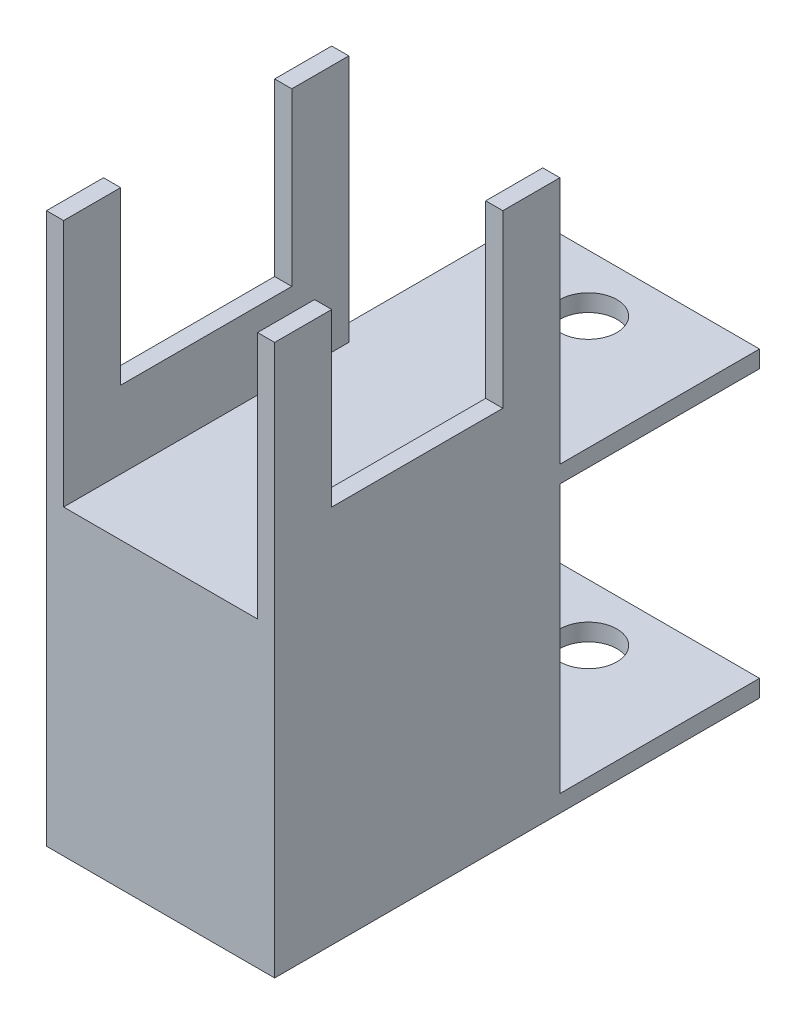
ISO-10303-21;
HEADER;
FILE_DESCRIPTION(('STEP AP214'),'2;1');
FILE_NAME('part.step','',(''),(''),'','','');
FILE_SCHEMA(('AUTOMOTIVE_DESIGN { 1 0 10303 214 1 1 1 1 }'));
ENDSEC;
DATA;
#1=APPLICATION_CONTEXT('core data for automotive mechanical design processes');
#2=APPLICATION_PROTOCOL_DEFINITION('international standard','automotive_design',2000,#1);
#3=PRODUCT_CONTEXT('',#1,'mechanical');
#4=PRODUCT('Part','Part','',(#3));
#5=PRODUCT_RELATED_PRODUCT_CATEGORY('part','',(#4));
#6=PRODUCT_DEFINITION_FORMATION('','',#4);
#7=PRODUCT_DEFINITION_CONTEXT('part definition',#1,'design');
#8=PRODUCT_DEFINITION('design','',#6,#7);
#9=PRODUCT_DEFINITION_SHAPE('','',#8);
#10=(LENGTH_UNIT() NAMED_UNIT(*) SI_UNIT(.MILLI.,.METRE.));
#11=(NAMED_UNIT(*) PLANE_ANGLE_UNIT() SI_UNIT($,.RADIAN.));
#12=(NAMED_UNIT(*) SI_UNIT($,.STERADIAN.) SOLID_ANGLE_UNIT());
#13=UNCERTAINTY_MEASURE_WITH_UNIT(LENGTH_MEASURE(1.E-05),#10,'distance_accuracy_value','');
#14=(GEOMETRIC_REPRESENTATION_CONTEXT(3) GLOBAL_UNCERTAINTY_ASSIGNED_CONTEXT((#13)) GLOBAL_UNIT_ASSIGNED_CONTEXT((#10,
#11,#12)) REPRESENTATION_CONTEXT('',''));
#15=CARTESIAN_POINT('',(0.,0.,0.));
#16=DIRECTION('',(0.,0.,1.));
#17=DIRECTION('',(1.,0.,0.));
#18=AXIS2_PLACEMENT_3D('',#15,#16,#17);
#19=CARTESIAN_POINT('',(20.,70.,25.));
#20=DIRECTION('',(0.,0.,1.));
#21=DIRECTION('',(1.,0.,0.));
#22=AXIS2_PLACEMENT_3D('',#19,#20,#21);
#23=PLANE('',#22);
#24=DIRECTION('',(0.,-1.,0.));
#25=VECTOR('',#24,1.);
#26=CARTESIAN_POINT('',(17.,70.,25.));
#27=LINE('',#26,#25);
#28=CARTESIAN_POINT('',(17.,70.,25.));
#29=VERTEX_POINT('',#28);
#30=CARTESIAN_POINT('',(17.,26.5,25.));
#31=VERTEX_POINT('',#30);
#32=EDGE_CURVE('E182',#29,#31,#27,.T.);
#33=ORIENTED_EDGE('',*,*,#32,.F.);
#34=DIRECTION('',(-1.,0.,0.));
#35=VECTOR('',#34,1.);
#36=CARTESIAN_POINT('',(20.,70.,25.));
#37=LINE('',#36,#35);
#38=CARTESIAN_POINT('',(20.,70.,25.));
#39=VERTEX_POINT('',#38);
#40=EDGE_CURVE('E238',#39,#29,#37,.T.);
#41=ORIENTED_EDGE('',*,*,#40,.F.);
#42=DIRECTION('',(0.,1.,0.));
#43=VECTOR('',#42,1.);
#44=CARTESIAN_POINT('',(20.,70.,25.));
#45=LINE('',#44,#43);
#46=CARTESIAN_POINT('',(20.,26.5,25.));
#47=VERTEX_POINT('',#46);
#48=EDGE_CURVE('E268',#47,#39,#45,.T.);
#49=ORIENTED_EDGE('',*,*,#48,.F.);
#50=DIRECTION('',(-1.,0.,0.));
#51=VECTOR('',#50,1.);
#52=CARTESIAN_POINT('',(20.,26.5,25.));
#53=LINE('',#52,#51);
#54=EDGE_CURVE('E242',#47,#31,#53,.T.);
#55=ORIENTED_EDGE('',*,*,#54,.T.);
#56=EDGE_LOOP('',(#33,#41,#49,#55));
#57=FACE_BOUND('',#56,.T.);
#58=ADVANCED_FACE('F33',(#57),#23,.F.);
#59=DIRECTION('',(0.,1.,0.));
#60=VECTOR('',#59,1.);
#61=CARTESIAN_POINT('',(-17.,70.,25.));
#62=LINE('',#61,#60);
#63=CARTESIAN_POINT('',(-17.,26.5,25.));
#64=VERTEX_POINT('',#63);
#65=CARTESIAN_POINT('',(-17.,70.,25.));
#66=VERTEX_POINT('',#65);
#67=EDGE_CURVE('E315',#64,#66,#62,.T.);
#68=ORIENTED_EDGE('',*,*,#67,.F.);
#69=CARTESIAN_POINT('',(-20.,26.5,25.));
#70=VERTEX_POINT('',#69);
#71=EDGE_CURVE('E241',#64,#70,#53,.T.);
#72=ORIENTED_EDGE('',*,*,#71,.T.);
#73=DIRECTION('',(0.,1.,0.));
#74=VECTOR('',#73,1.);
#75=CARTESIAN_POINT('',(-20.,70.,25.));
#76=LINE('',#75,#74);
#77=CARTESIAN_POINT('',(-20.,70.,25.));
#78=VERTEX_POINT('',#77);
#79=EDGE_CURVE('E189',#70,#78,#76,.T.);
#80=ORIENTED_EDGE('',*,*,#79,.T.);
#81=EDGE_CURVE('E237',#66,#78,#37,.T.);
#82=ORIENTED_EDGE('',*,*,#81,.F.);
#83=EDGE_LOOP('',(#68,#72,#80,#82));
#84=FACE_BOUND('',#83,.T.);
#85=ADVANCED_FACE('F372',(#84),#23,.F.);
#86=CARTESIAN_POINT('',(20.,70.,35.));
#87=DIRECTION('',(0.,-1.,0.));
#88=DIRECTION('',(0.,0.,-1.));
#89=AXIS2_PLACEMENT_3D('',#86,#87,#88);
#90=PLANE('',#89);
#91=DIRECTION('',(0.,0.,-1.));
#92=VECTOR('',#91,1.);
#93=CARTESIAN_POINT('',(17.,70.,75.));
#94=LINE('',#93,#92);
#95=CARTESIAN_POINT('',(17.,70.,35.));
#96=VERTEX_POINT('',#95);
#97=EDGE_CURVE('E328',#96,#29,#94,.T.);
#98=ORIENTED_EDGE('',*,*,#97,.F.);
#99=DIRECTION('',(-1.,0.,0.));
#100=VECTOR('',#99,1.);
#101=CARTESIAN_POINT('',(20.,70.,35.));
#102=LINE('',#101,#100);
#103=CARTESIAN_POINT('',(20.,70.,35.));
#104=VERTEX_POINT('',#103);
#105=EDGE_CURVE('E234',#104,#96,#102,.T.);
#106=ORIENTED_EDGE('',*,*,#105,.F.);
#107=DIRECTION('',(0.,0.,1.));
#108=VECTOR('',#107,1.);
#109=CARTESIAN_POINT('',(20.,70.,35.));
#110=LINE('',#109,#108);
#111=EDGE_CURVE('E270',#39,#104,#110,.T.);
#112=ORIENTED_EDGE('',*,*,#111,.F.);
#113=ORIENTED_EDGE('',*,*,#40,.T.);
#114=EDGE_LOOP('',(#98,#106,#112,#113));
#115=FACE_BOUND('',#114,.T.);
#116=ADVANCED_FACE('F378',(#115),#90,.F.);
#117=DIRECTION('',(0.,0.,-1.));
#118=VECTOR('',#117,1.);
#119=CARTESIAN_POINT('',(-17.,70.,75.));
#120=LINE('',#119,#118);
#121=CARTESIAN_POINT('',(-17.,70.,35.));
#122=VERTEX_POINT('',#121);
#123=EDGE_CURVE('E332',#122,#66,#120,.T.);
#124=ORIENTED_EDGE('',*,*,#123,.T.);
#125=ORIENTED_EDGE('',*,*,#81,.T.);
#126=DIRECTION('',(0.,0.,1.));
#127=VECTOR('',#126,1.);
#128=CARTESIAN_POINT('',(-20.,70.,35.));
#129=LINE('',#128,#127);
#130=CARTESIAN_POINT('',(-20.,70.,35.));
#131=VERTEX_POINT('',#130);
#132=EDGE_CURVE('E192',#78,#131,#129,.T.);
#133=ORIENTED_EDGE('',*,*,#132,.T.);
#134=EDGE_CURVE('E233',#122,#131,#102,.T.);
#135=ORIENTED_EDGE('',*,*,#134,.F.);
#136=EDGE_LOOP('',(#124,#125,#133,#135));
#137=FACE_BOUND('',#136,.T.);
#138=ADVANCED_FACE('F422',(#137),#90,.F.);
#139=CARTESIAN_POINT('',(20.,40.,35.));
#140=DIRECTION('',(0.,0.,-1.));
#141=DIRECTION('',(-1.,0.,0.));
#142=AXIS2_PLACEMENT_3D('',#139,#140,#141);
#143=PLANE('',#142);
#144=DIRECTION('',(0.,1.,0.));
#145=VECTOR('',#144,1.);
#146=CARTESIAN_POINT('',(17.,40.,35.));
#147=LINE('',#146,#145);
#148=CARTESIAN_POINT('',(17.,40.,35.));
#149=VERTEX_POINT('',#148);
#150=EDGE_CURVE('E306',#149,#96,#147,.T.);
#151=ORIENTED_EDGE('',*,*,#150,.F.);
#152=DIRECTION('',(-1.,0.,0.));
#153=VECTOR('',#152,1.);
#154=CARTESIAN_POINT('',(20.,40.,35.));
#155=LINE('',#154,#153);
#156=CARTESIAN_POINT('',(20.,40.,35.));
#157=VERTEX_POINT('',#156);
#158=EDGE_CURVE('E230',#157,#149,#155,.T.);
#159=ORIENTED_EDGE('',*,*,#158,.F.);
#160=DIRECTION('',(0.,-1.,0.));
#161=VECTOR('',#160,1.);
#162=CARTESIAN_POINT('',(20.,40.,35.));
#163=LINE('',#162,#161);
#164=EDGE_CURVE('E276',#104,#157,#163,.T.);
#165=ORIENTED_EDGE('',*,*,#164,.F.);
#166=ORIENTED_EDGE('',*,*,#105,.T.);
#167=EDGE_LOOP('',(#151,#159,#165,#166));
#168=FACE_BOUND('',#167,.T.);
#169=ADVANCED_FACE('F420',(#168),#143,.F.);
#170=DIRECTION('',(0.,-1.,0.));
#171=VECTOR('',#170,1.);
#172=CARTESIAN_POINT('',(-17.,40.,35.));
#173=LINE('',#172,#171);
#174=CARTESIAN_POINT('',(-17.,40.,35.));
#175=VERTEX_POINT('',#174);
#176=EDGE_CURVE('E318',#122,#175,#173,.T.);
#177=ORIENTED_EDGE('',*,*,#176,.F.);
#178=ORIENTED_EDGE('',*,*,#134,.T.);
#179=DIRECTION('',(0.,-1.,0.));
#180=VECTOR('',#179,1.);
#181=CARTESIAN_POINT('',(-20.,40.,35.));
#182=LINE('',#181,#180);
#183=CARTESIAN_POINT('',(-20.,40.,35.));
#184=VERTEX_POINT('',#183);
#185=EDGE_CURVE('E195',#131,#184,#182,.T.);
#186=ORIENTED_EDGE('',*,*,#185,.T.);
#187=EDGE_CURVE('E229',#175,#184,#155,.T.);
#188=ORIENTED_EDGE('',*,*,#187,.F.);
#189=EDGE_LOOP('',(#177,#178,#186,#188));
#190=FACE_BOUND('',#189,.T.);
#191=ADVANCED_FACE('F418',(#190),#143,.F.);
#192=CARTESIAN_POINT('',(20.,40.,65.));
#193=DIRECTION('',(0.,-1.,0.));
#194=DIRECTION('',(0.,0.,-1.));
#195=AXIS2_PLACEMENT_3D('',#192,#193,#194);
#196=PLANE('',#195);
#197=DIRECTION('',(0.,0.,-1.));
#198=VECTOR('',#197,1.);
#199=CARTESIAN_POINT('',(17.,40.,65.));
#200=LINE('',#199,#198);
#201=CARTESIAN_POINT('',(17.,40.,65.));
#202=VERTEX_POINT('',#201);
#203=EDGE_CURVE('E309',#202,#149,#200,.T.);
#204=ORIENTED_EDGE('',*,*,#203,.F.);
#205=DIRECTION('',(-1.,0.,0.));
#206=VECTOR('',#205,1.);
#207=CARTESIAN_POINT('',(20.,40.,65.));
#208=LINE('',#207,#206);
#209=CARTESIAN_POINT('',(20.,40.,65.));
#210=VERTEX_POINT('',#209);
#211=EDGE_CURVE('E226',#210,#202,#208,.T.);
#212=ORIENTED_EDGE('',*,*,#211,.F.);
#213=DIRECTION('',(0.,0.,1.));
#214=VECTOR('',#213,1.);
#215=CARTESIAN_POINT('',(20.,40.,65.));
#216=LINE('',#215,#214);
#217=EDGE_CURVE('E278',#157,#210,#216,.T.);
#218=ORIENTED_EDGE('',*,*,#217,.F.);
#219=ORIENTED_EDGE('',*,*,#158,.T.);
#220=EDGE_LOOP('',(#204,#212,#218,#219));
#221=FACE_BOUND('',#220,.T.);
#222=ADVANCED_FACE('F416',(#221),#196,.F.);
#223=DIRECTION('',(0.,0.,1.));
#224=VECTOR('',#223,1.);
#225=CARTESIAN_POINT('',(-17.,40.,65.));
#226=LINE('',#225,#224);
#227=CARTESIAN_POINT('',(-17.,40.,65.));
#228=VERTEX_POINT('',#227);
#229=EDGE_CURVE('E321',#175,#228,#226,.T.);
#230=ORIENTED_EDGE('',*,*,#229,.F.);
#231=ORIENTED_EDGE('',*,*,#187,.T.);
#232=DIRECTION('',(0.,0.,1.));
#233=VECTOR('',#232,1.);
#234=CARTESIAN_POINT('',(-20.,40.,65.));
#235=LINE('',#234,#233);
#236=CARTESIAN_POINT('',(-20.,40.,65.));
#237=VERTEX_POINT('',#236);
#238=EDGE_CURVE('E198',#184,#237,#235,.T.);
#239=ORIENTED_EDGE('',*,*,#238,.T.);
#240=EDGE_CURVE('E225',#228,#237,#208,.T.);
#241=ORIENTED_EDGE('',*,*,#240,.F.);
#242=EDGE_LOOP('',(#230,#231,#239,#241));
#243=FACE_BOUND('',#242,.T.);
#244=ADVANCED_FACE('F414',(#243),#196,.F.);
#245=CARTESIAN_POINT('',(20.,70.,65.));
#246=DIRECTION('',(0.,0.,1.));
#247=DIRECTION('',(1.,0.,0.));
#248=AXIS2_PLACEMENT_3D('',#245,#246,#247);
#249=PLANE('',#248);
#250=DIRECTION('',(0.,-1.,0.));
#251=VECTOR('',#250,1.);
#252=CARTESIAN_POINT('',(17.,70.,65.));
#253=LINE('',#252,#251);
#254=CARTESIAN_POINT('',(17.,70.,65.));
#255=VERTEX_POINT('',#254);
#256=EDGE_CURVE('E312',#255,#202,#253,.T.);
#257=ORIENTED_EDGE('',*,*,#256,.F.);
#258=DIRECTION('',(-1.,0.,0.));
#259=VECTOR('',#258,1.);
#260=CARTESIAN_POINT('',(20.,70.,65.));
#261=LINE('',#260,#259);
#262=CARTESIAN_POINT('',(20.,70.,65.));
#263=VERTEX_POINT('',#262);
#264=EDGE_CURVE('E222',#263,#255,#261,.T.);
#265=ORIENTED_EDGE('',*,*,#264,.F.);
#266=DIRECTION('',(0.,1.,0.));
#267=VECTOR('',#266,1.);
#268=CARTESIAN_POINT('',(20.,70.,65.));
#269=LINE('',#268,#267);
#270=EDGE_CURVE('E280',#210,#263,#269,.T.);
#271=ORIENTED_EDGE('',*,*,#270,.F.);
#272=ORIENTED_EDGE('',*,*,#211,.T.);
#273=EDGE_LOOP('',(#257,#265,#271,#272));
#274=FACE_BOUND('',#273,.T.);
#275=ADVANCED_FACE('F411',(#274),#249,.F.);
#276=DIRECTION('',(0.,1.,0.));
#277=VECTOR('',#276,1.);
#278=CARTESIAN_POINT('',(-17.,70.,65.));
#279=LINE('',#278,#277);
#280=CARTESIAN_POINT('',(-17.,70.,65.));
#281=VERTEX_POINT('',#280);
#282=EDGE_CURVE('E324',#228,#281,#279,.T.);
#283=ORIENTED_EDGE('',*,*,#282,.F.);
#284=ORIENTED_EDGE('',*,*,#240,.T.);
#285=DIRECTION('',(0.,1.,0.));
#286=VECTOR('',#285,1.);
#287=CARTESIAN_POINT('',(-20.,70.,65.));
#288=LINE('',#287,#286);
#289=CARTESIAN_POINT('',(-20.,70.,65.));
#290=VERTEX_POINT('',#289);
#291=EDGE_CURVE('E201',#237,#290,#288,.T.);
#292=ORIENTED_EDGE('',*,*,#291,.T.);
#293=EDGE_CURVE('E221',#281,#290,#261,.T.);
#294=ORIENTED_EDGE('',*,*,#293,.F.);
#295=EDGE_LOOP('',(#283,#284,#292,#294));
#296=FACE_BOUND('',#295,.T.);
#297=ADVANCED_FACE('F410',(#296),#249,.F.);
#298=CARTESIAN_POINT('',(20.,70.,75.));
#299=DIRECTION('',(0.,-1.,0.));
#300=DIRECTION('',(0.,0.,-1.));
#301=AXIS2_PLACEMENT_3D('',#298,#299,#300);
#302=PLANE('',#301);
#303=CARTESIAN_POINT('',(17.,70.,75.));
#304=VERTEX_POINT('',#303);
#305=EDGE_CURVE('E292',#304,#255,#94,.T.);
#306=ORIENTED_EDGE('',*,*,#305,.F.);
#307=DIRECTION('',(-1.,0.,0.));
#308=VECTOR('',#307,1.);
#309=CARTESIAN_POINT('',(20.,70.,75.));
#310=LINE('',#309,#308);
#311=CARTESIAN_POINT('',(20.,70.,75.));
#312=VERTEX_POINT('',#311);
#313=EDGE_CURVE('E218',#312,#304,#310,.T.);
#314=ORIENTED_EDGE('',*,*,#313,.F.);
#315=DIRECTION('',(0.,0.,1.));
#316=VECTOR('',#315,1.);
#317=CARTESIAN_POINT('',(20.,70.,75.));
#318=LINE('',#317,#316);
#319=EDGE_CURVE('E282',#263,#312,#318,.T.);
#320=ORIENTED_EDGE('',*,*,#319,.F.);
#321=ORIENTED_EDGE('',*,*,#264,.T.);
#322=EDGE_LOOP('',(#306,#314,#320,#321));
#323=FACE_BOUND('',#322,.T.);
#324=ADVANCED_FACE('F289',(#323),#302,.F.);
#325=CARTESIAN_POINT('',(-17.,70.,75.));
#326=VERTEX_POINT('',#325);
#327=EDGE_CURVE('E329',#326,#281,#120,.T.);
#328=ORIENTED_EDGE('',*,*,#327,.T.);
#329=ORIENTED_EDGE('',*,*,#293,.T.);
#330=DIRECTION('',(0.,0.,1.));
#331=VECTOR('',#330,1.);
#332=CARTESIAN_POINT('',(-20.,70.,75.));
#333=LINE('',#332,#331);
#334=CARTESIAN_POINT('',(-20.,70.,75.));
#335=VERTEX_POINT('',#334);
#336=EDGE_CURVE('E204',#290,#335,#333,.T.);
#337=ORIENTED_EDGE('',*,*,#336,.T.);
#338=EDGE_CURVE('E217',#326,#335,#310,.T.);
#339=ORIENTED_EDGE('',*,*,#338,.F.);
#340=EDGE_LOOP('',(#328,#329,#337,#339));
#341=FACE_BOUND('',#340,.T.);
#342=ADVANCED_FACE('F399',(#341),#302,.F.);
#343=CARTESIAN_POINT('',(20.,-26.5,75.));
#344=DIRECTION('',(0.,0.,-1.));
#345=DIRECTION('',(-1.,0.,0.));
#346=AXIS2_PLACEMENT_3D('',#343,#344,#345);
#347=PLANE('',#346);
#348=DIRECTION('',(0.,1.,0.));
#349=VECTOR('',#348,1.);
#350=CARTESIAN_POINT('',(17.,70.,75.));
#351=LINE('',#350,#349);
#352=CARTESIAN_POINT('',(17.,26.5,75.));
#353=VERTEX_POINT('',#352);
#354=EDGE_CURVE('E340',#353,#304,#351,.T.);
#355=ORIENTED_EDGE('',*,*,#354,.F.);
#356=DIRECTION('',(1.,0.,0.));
#357=VECTOR('',#356,1.);
#358=CARTESIAN_POINT('',(17.,26.5,75.));
#359=LINE('',#358,#357);
#360=CARTESIAN_POINT('',(-17.,26.5,75.));
#361=VERTEX_POINT('',#360);
#362=EDGE_CURVE('E336',#361,#353,#359,.T.);
#363=ORIENTED_EDGE('',*,*,#362,.F.);
#364=DIRECTION('',(0.,-1.,0.));
#365=VECTOR('',#364,1.);
#366=CARTESIAN_POINT('',(-17.,70.,75.));
#367=LINE('',#366,#365);
#368=EDGE_CURVE('E338',#326,#361,#367,.T.);
#369=ORIENTED_EDGE('',*,*,#368,.F.);
#370=ORIENTED_EDGE('',*,*,#338,.T.);
#371=DIRECTION('',(0.,-1.,0.));
#372=VECTOR('',#371,1.);
#373=CARTESIAN_POINT('',(-20.,-26.5,75.));
#374=LINE('',#373,#372);
#375=CARTESIAN_POINT('',(-20.,-26.5,75.));
#376=VERTEX_POINT('',#375);
#377=EDGE_CURVE('E207',#335,#376,#374,.T.);
#378=ORIENTED_EDGE('',*,*,#377,.T.);
#379=DIRECTION('',(-1.,0.,0.));
#380=VECTOR('',#379,1.);
#381=CARTESIAN_POINT('',(20.,-26.5,75.));
#382=LINE('',#381,#380);
#383=CARTESIAN_POINT('',(20.,-26.5,75.));
#384=VERTEX_POINT('',#383);
#385=EDGE_CURVE('E169',#384,#376,#382,.T.);
#386=ORIENTED_EDGE('',*,*,#385,.F.);
#387=DIRECTION('',(0.,-1.,0.));
#388=VECTOR('',#387,1.);
#389=CARTESIAN_POINT('',(20.,-26.5,75.));
#390=LINE('',#389,#388);
#391=EDGE_CURVE('E157',#312,#384,#390,.T.);
#392=ORIENTED_EDGE('',*,*,#391,.F.);
#393=ORIENTED_EDGE('',*,*,#313,.T.);
#394=EDGE_LOOP('',(#355,#363,#369,#370,#378,#386,#392,#393));
#395=FACE_BOUND('',#394,.T.);
#396=ADVANCED_FACE('F295',(#395),#347,.F.);
#397=CARTESIAN_POINT('',(20.,23.5,25.));
#398=DIRECTION('',(0.,0.,1.));
#399=DIRECTION('',(1.,0.,0.));
#400=AXIS2_PLACEMENT_3D('',#397,#398,#399);
#401=PLANE('',#400);
#402=DIRECTION('',(0.,1.,0.));
#403=VECTOR('',#402,1.);
#404=CARTESIAN_POINT('',(-20.,23.5,25.));
#405=LINE('',#404,#403);
#406=CARTESIAN_POINT('',(-20.,-23.5,25.));
#407=VERTEX_POINT('',#406);
#408=CARTESIAN_POINT('',(-20.,23.5,25.));
#409=VERTEX_POINT('',#408);
#410=EDGE_CURVE('E178',#407,#409,#405,.T.);
#411=ORIENTED_EDGE('',*,*,#410,.T.);
#412=DIRECTION('',(-1.,0.,0.));
#413=VECTOR('',#412,1.);
#414=CARTESIAN_POINT('',(20.,23.5,25.));
#415=LINE('',#414,#413);
#416=CARTESIAN_POINT('',(20.,23.5,25.));
#417=VERTEX_POINT('',#416);
#418=EDGE_CURVE('E11',#417,#409,#415,.T.);
#419=ORIENTED_EDGE('',*,*,#418,.F.);
#420=DIRECTION('',(0.,1.,0.));
#421=VECTOR('',#420,1.);
#422=CARTESIAN_POINT('',(20.,23.5,25.));
#423=LINE('',#422,#421);
#424=CARTESIAN_POINT('',(20.,-23.5,25.));
#425=VERTEX_POINT('',#424);
#426=EDGE_CURVE('E213',#425,#417,#423,.T.);
#427=ORIENTED_EDGE('',*,*,#426,.F.);
#428=DIRECTION('',(-1.,0.,0.));
#429=VECTOR('',#428,1.);
#430=CARTESIAN_POINT('',(20.,-23.5,25.));
#431=LINE('',#430,#429);
#432=EDGE_CURVE('E174',#425,#407,#431,.T.);
#433=ORIENTED_EDGE('',*,*,#432,.T.);
#434=EDGE_LOOP('',(#411,#419,#427,#433));
#435=FACE_BOUND('',#434,.T.);
#436=ADVANCED_FACE('F35',(#435),#401,.F.);
#437=CARTESIAN_POINT('',(20.,23.5,25.));
#438=DIRECTION('',(0.,1.,0.));
#439=DIRECTION('',(0.,0.,1.));
#440=AXIS2_PLACEMENT_3D('',#437,#438,#439);
#441=PLANE('',#440);
#442=CARTESIAN_POINT('',(0.,23.5,0.));
#443=DIRECTION('',(0.,1.,0.));
#444=DIRECTION('',(0.,0.,1.));
#445=AXIS2_PLACEMENT_3D('',#442,#443,#444);
#446=CIRCLE('',#445,5.);
#447=CARTESIAN_POINT('',(0.,23.5,5.));
#448=VERTEX_POINT('',#447);
#449=EDGE_CURVE('E343',#448,#448,#446,.T.);
#450=ORIENTED_EDGE('',*,*,#449,.T.);
#451=EDGE_LOOP('',(#450));
#452=FACE_BOUND('',#451,.T.);
#453=DIRECTION('',(0.,0.,-1.));
#454=VECTOR('',#453,1.);
#455=CARTESIAN_POINT('',(-20.,23.5,25.));
#456=LINE('',#455,#454);
#457=CARTESIAN_POINT('',(-20.,23.5,-10.));
#458=VERTEX_POINT('',#457);
#459=EDGE_CURVE('E181',#409,#458,#456,.T.);
#460=ORIENTED_EDGE('',*,*,#459,.T.);
#461=DIRECTION('',(-1.,0.,0.));
#462=VECTOR('',#461,1.);
#463=CARTESIAN_POINT('',(20.,23.5,-10.));
#464=LINE('',#463,#462);
#465=CARTESIAN_POINT('',(20.,23.5,-10.));
#466=VERTEX_POINT('',#465);
#467=EDGE_CURVE('E42',#466,#458,#464,.T.);
#468=ORIENTED_EDGE('',*,*,#467,.F.);
#469=DIRECTION('',(0.,0.,-1.));
#470=VECTOR('',#469,1.);
#471=CARTESIAN_POINT('',(20.,23.5,25.));
#472=LINE('',#471,#470);
#473=EDGE_CURVE('E117',#417,#466,#472,.T.);
#474=ORIENTED_EDGE('',*,*,#473,.F.);
#475=ORIENTED_EDGE('',*,*,#418,.T.);
#476=EDGE_LOOP('',(#460,#468,#474,#475));
#477=FACE_BOUND('',#476,.T.);
#478=ADVANCED_FACE('F388',(#452,#477),#441,.F.);
#479=CARTESIAN_POINT('',(20.,23.5,-10.));
#480=DIRECTION('',(0.,0.,1.));
#481=DIRECTION('',(1.,0.,0.));
#482=AXIS2_PLACEMENT_3D('',#479,#480,#481);
#483=PLANE('',#482);
#484=DIRECTION('',(0.,1.,0.));
#485=VECTOR('',#484,1.);
#486=CARTESIAN_POINT('',(-20.,23.5,-10.));
#487=LINE('',#486,#485);
#488=CARTESIAN_POINT('',(-20.,26.5,-10.));
#489=VERTEX_POINT('',#488);
#490=EDGE_CURVE('E184',#458,#489,#487,.T.);
#491=ORIENTED_EDGE('',*,*,#490,.T.);
#492=DIRECTION('',(-1.,0.,0.));
#493=VECTOR('',#492,1.);
#494=CARTESIAN_POINT('',(20.,26.5,-10.));
#495=LINE('',#494,#493);
#496=CARTESIAN_POINT('',(20.,26.5,-10.));
#497=VERTEX_POINT('',#496);
#498=EDGE_CURVE('E245',#497,#489,#495,.T.);
#499=ORIENTED_EDGE('',*,*,#498,.F.);
#500=DIRECTION('',(0.,1.,0.));
#501=VECTOR('',#500,1.);
#502=CARTESIAN_POINT('',(20.,23.5,-10.));
#503=LINE('',#502,#501);
#504=EDGE_CURVE('E254',#466,#497,#503,.T.);
#505=ORIENTED_EDGE('',*,*,#504,.F.);
#506=ORIENTED_EDGE('',*,*,#467,.T.);
#507=EDGE_LOOP('',(#491,#499,#505,#506));
#508=FACE_BOUND('',#507,.T.);
#509=ADVANCED_FACE('F252',(#508),#483,.F.);
#510=CARTESIAN_POINT('',(20.,26.5,-10.));
#511=DIRECTION('',(0.,-1.,0.));
#512=DIRECTION('',(0.,0.,-1.));
#513=AXIS2_PLACEMENT_3D('',#510,#511,#512);
#514=PLANE('',#513);
#515=CARTESIAN_POINT('',(0.,26.5,0.));
#516=DIRECTION('',(0.,-1.,0.));
#517=DIRECTION('',(0.,0.,-1.));
#518=AXIS2_PLACEMENT_3D('',#515,#516,#517);
#519=CIRCLE('',#518,5.);
#520=CARTESIAN_POINT('',(0.,26.5,-5.));
#521=VERTEX_POINT('',#520);
#522=EDGE_CURVE('E346',#521,#521,#519,.T.);
#523=ORIENTED_EDGE('',*,*,#522,.T.);
#524=EDGE_LOOP('',(#523));
#525=FACE_BOUND('',#524,.T.);
#526=ORIENTED_EDGE('',*,*,#71,.F.);
#527=DIRECTION('',(0.,0.,-1.));
#528=VECTOR('',#527,1.);
#529=CARTESIAN_POINT('',(-17.,26.5,75.));
#530=LINE('',#529,#528);
#531=EDGE_CURVE('E49',#361,#64,#530,.T.);
#532=ORIENTED_EDGE('',*,*,#531,.F.);
#533=ORIENTED_EDGE('',*,*,#362,.T.);
#534=DIRECTION('',(0.,0.,-1.));
#535=VECTOR('',#534,1.);
#536=CARTESIAN_POINT('',(17.,26.5,75.));
#537=LINE('',#536,#535);
#538=EDGE_CURVE('E334',#353,#31,#537,.T.);
#539=ORIENTED_EDGE('',*,*,#538,.T.);
#540=ORIENTED_EDGE('',*,*,#54,.F.);
#541=DIRECTION('',(0.,0.,1.));
#542=VECTOR('',#541,1.);
#543=CARTESIAN_POINT('',(20.,26.5,-10.));
#544=LINE('',#543,#542);
#545=EDGE_CURVE('E265',#497,#47,#544,.T.);
#546=ORIENTED_EDGE('',*,*,#545,.F.);
#547=ORIENTED_EDGE('',*,*,#498,.T.);
#548=DIRECTION('',(0.,0.,1.));
#549=VECTOR('',#548,1.);
#550=CARTESIAN_POINT('',(-20.,26.5,-10.));
#551=LINE('',#550,#549);
#552=EDGE_CURVE('E186',#489,#70,#551,.T.);
#553=ORIENTED_EDGE('',*,*,#552,.T.);
#554=EDGE_LOOP('',(#526,#532,#533,#539,#540,#546,#547,#553));
#555=FACE_BOUND('',#554,.T.);
#556=ADVANCED_FACE('F261',(#525,#555),#514,.F.);
#557=CARTESIAN_POINT('',(20.,-26.5,-10.));
#558=DIRECTION('',(0.,1.,0.));
#559=DIRECTION('',(0.,0.,1.));
#560=AXIS2_PLACEMENT_3D('',#557,#558,#559);
#561=PLANE('',#560);
#562=CARTESIAN_POINT('',(0.,-26.5,0.));
#563=DIRECTION('',(0.,1.,0.));
#564=DIRECTION('',(0.,0.,1.));
#565=AXIS2_PLACEMENT_3D('',#562,#563,#564);
#566=CIRCLE('',#565,5.);
#567=CARTESIAN_POINT('',(0.,-26.5,5.));
#568=VERTEX_POINT('',#567);
#569=EDGE_CURVE('E349',#568,#568,#566,.T.);
#570=ORIENTED_EDGE('',*,*,#569,.T.);
#571=EDGE_LOOP('',(#570));
#572=FACE_BOUND('',#571,.T.);
#573=DIRECTION('',(0.,0.,-1.));
#574=VECTOR('',#573,1.);
#575=CARTESIAN_POINT('',(-20.,-26.5,-10.));
#576=LINE('',#575,#574);
#577=CARTESIAN_POINT('',(-20.,-26.5,-10.));
#578=VERTEX_POINT('',#577);
#579=EDGE_CURVE('E166',#376,#578,#576,.T.);
#580=ORIENTED_EDGE('',*,*,#579,.T.);
#581=DIRECTION('',(-1.,0.,0.));
#582=VECTOR('',#581,1.);
#583=CARTESIAN_POINT('',(20.,-26.5,-10.));
#584=LINE('',#583,#582);
#585=CARTESIAN_POINT('',(20.,-26.5,-10.));
#586=VERTEX_POINT('',#585);
#587=EDGE_CURVE('E163',#586,#578,#584,.T.);
#588=ORIENTED_EDGE('',*,*,#587,.F.);
#589=DIRECTION('',(0.,0.,-1.));
#590=VECTOR('',#589,1.);
#591=CARTESIAN_POINT('',(20.,-26.5,-10.));
#592=LINE('',#591,#590);
#593=EDGE_CURVE('E150',#384,#586,#592,.T.);
#594=ORIENTED_EDGE('',*,*,#593,.F.);
#595=ORIENTED_EDGE('',*,*,#385,.T.);
#596=EDGE_LOOP('',(#580,#588,#594,#595));
#597=FACE_BOUND('',#596,.T.);
#598=ADVANCED_FACE('F164',(#572,#597),#561,.F.);
#599=CARTESIAN_POINT('',(20.,-23.5,-10.));
#600=DIRECTION('',(0.,0.,1.));
#601=DIRECTION('',(0.,-1.,0.));
#602=AXIS2_PLACEMENT_3D('',#599,#600,#601);
#603=PLANE('',#602);
#604=DIRECTION('',(0.,1.,0.));
#605=VECTOR('',#604,1.);
#606=CARTESIAN_POINT('',(-20.,-23.5,-10.));
#607=LINE('',#606,#605);
#608=CARTESIAN_POINT('',(-20.,-23.5,-10.));
#609=VERTEX_POINT('',#608);
#610=EDGE_CURVE('E210',#578,#609,#607,.T.);
#611=ORIENTED_EDGE('',*,*,#610,.T.);
#612=DIRECTION('',(-1.,0.,0.));
#613=VECTOR('',#612,1.);
#614=CARTESIAN_POINT('',(20.,-23.5,-10.));
#615=LINE('',#614,#613);
#616=CARTESIAN_POINT('',(20.,-23.5,-10.));
#617=VERTEX_POINT('',#616);
#618=EDGE_CURVE('E170',#617,#609,#615,.T.);
#619=ORIENTED_EDGE('',*,*,#618,.F.);
#620=DIRECTION('',(0.,1.,0.));
#621=VECTOR('',#620,1.);
#622=CARTESIAN_POINT('',(20.,-23.5,-10.));
#623=LINE('',#622,#621);
#624=EDGE_CURVE('E154',#586,#617,#623,.T.);
#625=ORIENTED_EDGE('',*,*,#624,.F.);
#626=ORIENTED_EDGE('',*,*,#587,.T.);
#627=EDGE_LOOP('',(#611,#619,#625,#626));
#628=FACE_BOUND('',#627,.T.);
#629=ADVANCED_FACE('F172',(#628),#603,.F.);
#630=CARTESIAN_POINT('',(20.,-23.5,25.));
#631=DIRECTION('',(0.,-1.,0.));
#632=DIRECTION('',(0.,0.,-1.));
#633=AXIS2_PLACEMENT_3D('',#630,#631,#632);
#634=PLANE('',#633);
#635=CARTESIAN_POINT('',(0.,-23.5,0.));
#636=DIRECTION('',(0.,-1.,0.));
#637=DIRECTION('',(0.,0.,-1.));
#638=AXIS2_PLACEMENT_3D('',#635,#636,#637);
#639=CIRCLE('',#638,5.);
#640=CARTESIAN_POINT('',(0.,-23.5,-5.));
#641=VERTEX_POINT('',#640);
#642=EDGE_CURVE('E37',#641,#641,#639,.T.);
#643=ORIENTED_EDGE('',*,*,#642,.T.);
#644=EDGE_LOOP('',(#643));
#645=FACE_BOUND('',#644,.T.);
#646=DIRECTION('',(0.,0.,1.));
#647=VECTOR('',#646,1.);
#648=CARTESIAN_POINT('',(-20.,-23.5,25.));
#649=LINE('',#648,#647);
#650=EDGE_CURVE('E109',#609,#407,#649,.T.);
#651=ORIENTED_EDGE('',*,*,#650,.T.);
#652=ORIENTED_EDGE('',*,*,#432,.F.);
#653=DIRECTION('',(0.,0.,1.));
#654=VECTOR('',#653,1.);
#655=CARTESIAN_POINT('',(20.,-23.5,25.));
#656=LINE('',#655,#654);
#657=EDGE_CURVE('E58',#617,#425,#656,.T.);
#658=ORIENTED_EDGE('',*,*,#657,.F.);
#659=ORIENTED_EDGE('',*,*,#618,.T.);
#660=EDGE_LOOP('',(#651,#652,#658,#659));
#661=FACE_BOUND('',#660,.T.);
#662=ADVANCED_FACE('F298',(#645,#661),#634,.F.);
#663=CARTESIAN_POINT('',(20.,0.,0.));
#664=DIRECTION('',(1.,0.,0.));
#665=DIRECTION('',(0.,0.,-1.));
#666=AXIS2_PLACEMENT_3D('',#663,#664,#665);
#667=PLANE('',#666);
#668=ORIENTED_EDGE('',*,*,#426,.T.);
#669=ORIENTED_EDGE('',*,*,#473,.T.);
#670=ORIENTED_EDGE('',*,*,#504,.T.);
#671=ORIENTED_EDGE('',*,*,#545,.T.);
#672=ORIENTED_EDGE('',*,*,#48,.T.);
#673=ORIENTED_EDGE('',*,*,#111,.T.);
#674=ORIENTED_EDGE('',*,*,#164,.T.);
#675=ORIENTED_EDGE('',*,*,#217,.T.);
#676=ORIENTED_EDGE('',*,*,#270,.T.);
#677=ORIENTED_EDGE('',*,*,#319,.T.);
#678=ORIENTED_EDGE('',*,*,#391,.T.);
#679=ORIENTED_EDGE('',*,*,#593,.T.);
#680=ORIENTED_EDGE('',*,*,#624,.T.);
#681=ORIENTED_EDGE('',*,*,#657,.T.);
#682=EDGE_LOOP('',(#668,#669,#670,#671,#672,#673,#674,#675,#676,#677,#678,#679,#680,#681));
#683=FACE_BOUND('',#682,.T.);
#684=ADVANCED_FACE('F152',(#683),#667,.T.);
#685=CARTESIAN_POINT('',(-20.,0.,0.));
#686=DIRECTION('',(1.,0.,0.));
#687=DIRECTION('',(0.,0.,-1.));
#688=AXIS2_PLACEMENT_3D('',#685,#686,#687);
#689=PLANE('',#688);
#690=ORIENTED_EDGE('',*,*,#410,.F.);
#691=ORIENTED_EDGE('',*,*,#650,.F.);
#692=ORIENTED_EDGE('',*,*,#610,.F.);
#693=ORIENTED_EDGE('',*,*,#579,.F.);
#694=ORIENTED_EDGE('',*,*,#377,.F.);
#695=ORIENTED_EDGE('',*,*,#336,.F.);
#696=ORIENTED_EDGE('',*,*,#291,.F.);
#697=ORIENTED_EDGE('',*,*,#238,.F.);
#698=ORIENTED_EDGE('',*,*,#185,.F.);
#699=ORIENTED_EDGE('',*,*,#132,.F.);
#700=ORIENTED_EDGE('',*,*,#79,.F.);
#701=ORIENTED_EDGE('',*,*,#552,.F.);
#702=ORIENTED_EDGE('',*,*,#490,.F.);
#703=ORIENTED_EDGE('',*,*,#459,.F.);
#704=EDGE_LOOP('',(#690,#691,#692,#693,#694,#695,#696,#697,#698,#699,#700,#701,#702,#703));
#705=FACE_BOUND('',#704,.T.);
#706=ADVANCED_FACE('F258',(#705),#689,.F.);
#707=CARTESIAN_POINT('',(17.,70.,75.));
#708=DIRECTION('',(-1.,0.,0.));
#709=DIRECTION('',(0.,-1.,0.));
#710=AXIS2_PLACEMENT_3D('',#707,#708,#709);
#711=PLANE('',#710);
#712=ORIENTED_EDGE('',*,*,#32,.T.);
#713=ORIENTED_EDGE('',*,*,#538,.F.);
#714=ORIENTED_EDGE('',*,*,#354,.T.);
#715=ORIENTED_EDGE('',*,*,#305,.T.);
#716=ORIENTED_EDGE('',*,*,#256,.T.);
#717=ORIENTED_EDGE('',*,*,#203,.T.);
#718=ORIENTED_EDGE('',*,*,#150,.T.);
#719=ORIENTED_EDGE('',*,*,#97,.T.);
#720=EDGE_LOOP('',(#712,#713,#714,#715,#716,#717,#718,#719));
#721=FACE_BOUND('',#720,.T.);
#722=ADVANCED_FACE('F368',(#721),#711,.T.);
#723=CARTESIAN_POINT('',(-17.,70.,75.));
#724=DIRECTION('',(1.,0.,0.));
#725=DIRECTION('',(0.,1.,0.));
#726=AXIS2_PLACEMENT_3D('',#723,#724,#725);
#727=PLANE('',#726);
#728=ORIENTED_EDGE('',*,*,#67,.T.);
#729=ORIENTED_EDGE('',*,*,#123,.F.);
#730=ORIENTED_EDGE('',*,*,#176,.T.);
#731=ORIENTED_EDGE('',*,*,#229,.T.);
#732=ORIENTED_EDGE('',*,*,#282,.T.);
#733=ORIENTED_EDGE('',*,*,#327,.F.);
#734=ORIENTED_EDGE('',*,*,#368,.T.);
#735=ORIENTED_EDGE('',*,*,#531,.T.);
#736=EDGE_LOOP('',(#728,#729,#730,#731,#732,#733,#734,#735));
#737=FACE_BOUND('',#736,.T.);
#738=ADVANCED_FACE('F360',(#737),#727,.T.);
#739=CARTESIAN_POINT('',(0.,-26.5,0.));
#740=DIRECTION('',(0.,1.,0.));
#741=DIRECTION('',(0.,0.,1.));
#742=AXIS2_PLACEMENT_3D('',#739,#740,#741);
#743=CYLINDRICAL_SURFACE('',#742,5.);
#744=ORIENTED_EDGE('',*,*,#569,.F.);
#745=EDGE_LOOP('',(#744));
#746=FACE_BOUND('',#745,.T.);
#747=ORIENTED_EDGE('',*,*,#642,.F.);
#748=EDGE_LOOP('',(#747));
#749=FACE_BOUND('',#748,.T.);
#750=ADVANCED_FACE('F357',(#746,#749),#743,.F.);
#751=ORIENTED_EDGE('',*,*,#522,.F.);
#752=EDGE_LOOP('',(#751));
#753=FACE_BOUND('',#752,.T.);
#754=ORIENTED_EDGE('',*,*,#449,.F.);
#755=EDGE_LOOP('',(#754));
#756=FACE_BOUND('',#755,.T.);
#757=ADVANCED_FACE('F359',(#753,#756),#743,.F.);
#758=CLOSED_SHELL('',(#58,#85,#116,#138,#169,#191,#222,#244,#275,#297,#324,#342,#396,#436,#478,
#509,#556,#598,#629,#662,#684,#706,#722,#738,#750,#757));
#759=MANIFOLD_SOLID_BREP('B2',#758);
#760=ADVANCED_BREP_SHAPE_REPRESENTATION('',(#18,#759),#14);
#761=SHAPE_DEFINITION_REPRESENTATION(#9,#760);
ENDSEC;
END-ISO-10303-21;
